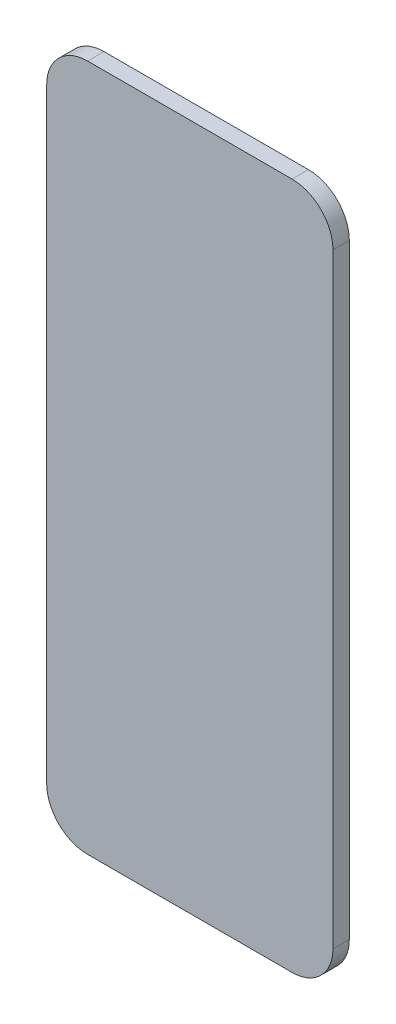
ISO-10303-21;
HEADER;
FILE_DESCRIPTION(('STEP AP214'),'2;1');
FILE_NAME('part.step','',(''),(''),'','','');
FILE_SCHEMA(('AUTOMOTIVE_DESIGN { 1 0 10303 214 1 1 1 1 }'));
ENDSEC;
DATA;
#1=APPLICATION_CONTEXT('core data for automotive mechanical design processes');
#2=APPLICATION_PROTOCOL_DEFINITION('international standard','automotive_design',2000,#1);
#3=PRODUCT_CONTEXT('',#1,'mechanical');
#4=PRODUCT('Part','Part','',(#3));
#5=PRODUCT_RELATED_PRODUCT_CATEGORY('part','',(#4));
#6=PRODUCT_DEFINITION_FORMATION('','',#4);
#7=PRODUCT_DEFINITION_CONTEXT('part definition',#1,'design');
#8=PRODUCT_DEFINITION('design','',#6,#7);
#9=PRODUCT_DEFINITION_SHAPE('','',#8);
#10=(LENGTH_UNIT() NAMED_UNIT(*) SI_UNIT(.MILLI.,.METRE.));
#11=(NAMED_UNIT(*) PLANE_ANGLE_UNIT() SI_UNIT($,.RADIAN.));
#12=(NAMED_UNIT(*) SI_UNIT($,.STERADIAN.) SOLID_ANGLE_UNIT());
#13=UNCERTAINTY_MEASURE_WITH_UNIT(LENGTH_MEASURE(1.E-05),#10,'distance_accuracy_value','');
#14=(GEOMETRIC_REPRESENTATION_CONTEXT(3) GLOBAL_UNCERTAINTY_ASSIGNED_CONTEXT((#13)) GLOBAL_UNIT_ASSIGNED_CONTEXT((#10,
#11,#12)) REPRESENTATION_CONTEXT('',''));
#15=CARTESIAN_POINT('',(0.,0.,0.));
#16=DIRECTION('',(0.,0.,1.));
#17=DIRECTION('',(1.,0.,0.));
#18=AXIS2_PLACEMENT_3D('',#15,#16,#17);
#19=CARTESIAN_POINT('',(0.,0.,40.));
#20=DIRECTION('',(1.,0.,0.));
#21=DIRECTION('',(0.,1.,0.));
#22=AXIS2_PLACEMENT_3D('',#19,#20,#21);
#23=PLANE('',#22);
#24=DIRECTION('',(0.,-1.,0.));
#25=VECTOR('',#24,1.);
#26=CARTESIAN_POINT('',(0.,0.,0.));
#27=LINE('',#26,#25);
#28=CARTESIAN_POINT('',(-3.13241496233526E-13,1580.,0.));
#29=VERTEX_POINT('',#28);
#30=CARTESIAN_POINT('',(0.,100.,0.));
#31=VERTEX_POINT('',#30);
#32=EDGE_CURVE('E131',#29,#31,#27,.T.);
#33=ORIENTED_EDGE('',*,*,#32,.T.);
#34=DIRECTION('',(0.,0.,-1.));
#35=VECTOR('',#34,1.);
#36=CARTESIAN_POINT('',(0.,100.,40.));
#37=LINE('',#36,#35);
#38=CARTESIAN_POINT('',(0.,100.,40.));
#39=VERTEX_POINT('',#38);
#40=EDGE_CURVE('E154',#31,#39,#37,.F.);
#41=ORIENTED_EDGE('',*,*,#40,.T.);
#42=DIRECTION('',(0.,-1.,0.));
#43=VECTOR('',#42,1.);
#44=CARTESIAN_POINT('',(0.,0.,40.));
#45=LINE('',#44,#43);
#46=CARTESIAN_POINT('',(-3.13241496233526E-13,1580.,40.));
#47=VERTEX_POINT('',#46);
#48=EDGE_CURVE('E129',#47,#39,#45,.T.);
#49=ORIENTED_EDGE('',*,*,#48,.F.);
#50=DIRECTION('',(0.,0.,-1.));
#51=VECTOR('',#50,1.);
#52=CARTESIAN_POINT('',(-3.13241496233526E-13,1580.,40.));
#53=LINE('',#52,#51);
#54=EDGE_CURVE('E151',#47,#29,#53,.T.);
#55=ORIENTED_EDGE('',*,*,#54,.T.);
#56=EDGE_LOOP('',(#33,#41,#49,#55));
#57=FACE_BOUND('',#56,.T.);
#58=ADVANCED_FACE('F36',(#57),#23,.F.);
#59=CARTESIAN_POINT('',(0.,0.,40.));
#60=DIRECTION('',(0.,1.,0.));
#61=DIRECTION('',(0.,0.,1.));
#62=AXIS2_PLACEMENT_3D('',#59,#60,#61);
#63=PLANE('',#62);
#64=DIRECTION('',(1.,0.,0.));
#65=VECTOR('',#64,1.);
#66=CARTESIAN_POINT('',(0.,0.,0.));
#67=LINE('',#66,#65);
#68=CARTESIAN_POINT('',(100.,0.,0.));
#69=VERTEX_POINT('',#68);
#70=CARTESIAN_POINT('',(600.,0.,0.));
#71=VERTEX_POINT('',#70);
#72=EDGE_CURVE('E127',#69,#71,#67,.T.);
#73=ORIENTED_EDGE('',*,*,#72,.T.);
#74=DIRECTION('',(0.,0.,-1.));
#75=VECTOR('',#74,1.);
#76=CARTESIAN_POINT('',(600.,0.,40.));
#77=LINE('',#76,#75);
#78=CARTESIAN_POINT('',(600.,0.,40.));
#79=VERTEX_POINT('',#78);
#80=EDGE_CURVE('E106',#71,#79,#77,.F.);
#81=ORIENTED_EDGE('',*,*,#80,.T.);
#82=DIRECTION('',(1.,0.,0.));
#83=VECTOR('',#82,1.);
#84=CARTESIAN_POINT('',(0.,0.,40.));
#85=LINE('',#84,#83);
#86=CARTESIAN_POINT('',(100.,0.,40.));
#87=VERTEX_POINT('',#86);
#88=EDGE_CURVE('E170',#87,#79,#85,.T.);
#89=ORIENTED_EDGE('',*,*,#88,.F.);
#90=DIRECTION('',(0.,0.,-1.));
#91=VECTOR('',#90,1.);
#92=CARTESIAN_POINT('',(100.,0.,40.));
#93=LINE('',#92,#91);
#94=EDGE_CURVE('E111',#87,#69,#93,.T.);
#95=ORIENTED_EDGE('',*,*,#94,.T.);
#96=EDGE_LOOP('',(#73,#81,#89,#95));
#97=FACE_BOUND('',#96,.T.);
#98=ADVANCED_FACE('F187',(#97),#63,.F.);
#99=CARTESIAN_POINT('',(700.,0.,40.));
#100=DIRECTION('',(-1.,0.,0.));
#101=DIRECTION('',(0.,-1.,0.));
#102=AXIS2_PLACEMENT_3D('',#99,#100,#101);
#103=PLANE('',#102);
#104=DIRECTION('',(0.,1.,0.));
#105=VECTOR('',#104,1.);
#106=CARTESIAN_POINT('',(700.,0.,40.));
#107=LINE('',#106,#105);
#108=CARTESIAN_POINT('',(700.,100.,40.));
#109=VERTEX_POINT('',#108);
#110=CARTESIAN_POINT('',(700.,1580.,40.));
#111=VERTEX_POINT('',#110);
#112=EDGE_CURVE('E120',#109,#111,#107,.T.);
#113=ORIENTED_EDGE('',*,*,#112,.F.);
#114=DIRECTION('',(0.,0.,-1.));
#115=VECTOR('',#114,1.);
#116=CARTESIAN_POINT('',(700.,100.,40.));
#117=LINE('',#116,#115);
#118=CARTESIAN_POINT('',(700.,100.,0.));
#119=VERTEX_POINT('',#118);
#120=EDGE_CURVE('E105',#109,#119,#117,.T.);
#121=ORIENTED_EDGE('',*,*,#120,.T.);
#122=DIRECTION('',(0.,1.,0.));
#123=VECTOR('',#122,1.);
#124=CARTESIAN_POINT('',(700.,0.,0.));
#125=LINE('',#124,#123);
#126=CARTESIAN_POINT('',(700.,1580.,0.));
#127=VERTEX_POINT('',#126);
#128=EDGE_CURVE('E118',#119,#127,#125,.T.);
#129=ORIENTED_EDGE('',*,*,#128,.T.);
#130=DIRECTION('',(0.,0.,-1.));
#131=VECTOR('',#130,1.);
#132=CARTESIAN_POINT('',(700.,1580.,40.));
#133=LINE('',#132,#131);
#134=EDGE_CURVE('E122',#127,#111,#133,.F.);
#135=ORIENTED_EDGE('',*,*,#134,.T.);
#136=EDGE_LOOP('',(#113,#121,#129,#135));
#137=FACE_BOUND('',#136,.T.);
#138=ADVANCED_FACE('F117',(#137),#103,.F.);
#139=CARTESIAN_POINT('',(-3.33066907387547E-13,1680.,40.));
#140=DIRECTION('',(0.,-1.,0.));
#141=DIRECTION('',(0.,0.,-1.));
#142=AXIS2_PLACEMENT_3D('',#139,#140,#141);
#143=PLANE('',#142);
#144=DIRECTION('',(-1.,0.,0.));
#145=VECTOR('',#144,1.);
#146=CARTESIAN_POINT('',(-3.33066907387547E-13,1680.,0.));
#147=LINE('',#146,#145);
#148=CARTESIAN_POINT('',(600.,1680.,0.));
#149=VERTEX_POINT('',#148);
#150=CARTESIAN_POINT('',(99.9999999999997,1680.,0.));
#151=VERTEX_POINT('',#150);
#152=EDGE_CURVE('E126',#149,#151,#147,.T.);
#153=ORIENTED_EDGE('',*,*,#152,.T.);
#154=DIRECTION('',(0.,0.,-1.));
#155=VECTOR('',#154,1.);
#156=CARTESIAN_POINT('',(99.9999999999997,1680.,40.));
#157=LINE('',#156,#155);
#158=CARTESIAN_POINT('',(99.9999999999997,1680.,40.));
#159=VERTEX_POINT('',#158);
#160=EDGE_CURVE('E11',#151,#159,#157,.F.);
#161=ORIENTED_EDGE('',*,*,#160,.T.);
#162=DIRECTION('',(-1.,0.,0.));
#163=VECTOR('',#162,1.);
#164=CARTESIAN_POINT('',(-3.33066907387547E-13,1680.,40.));
#165=LINE('',#164,#163);
#166=CARTESIAN_POINT('',(600.,1680.,40.));
#167=VERTEX_POINT('',#166);
#168=EDGE_CURVE('E135',#167,#159,#165,.T.);
#169=ORIENTED_EDGE('',*,*,#168,.F.);
#170=DIRECTION('',(0.,0.,-1.));
#171=VECTOR('',#170,1.);
#172=CARTESIAN_POINT('',(600.,1680.,40.));
#173=LINE('',#172,#171);
#174=EDGE_CURVE('E44',#167,#149,#173,.T.);
#175=ORIENTED_EDGE('',*,*,#174,.T.);
#176=EDGE_LOOP('',(#153,#161,#169,#175));
#177=FACE_BOUND('',#176,.T.);
#178=ADVANCED_FACE('F157',(#177),#143,.F.);
#179=CARTESIAN_POINT('',(0.,0.,40.));
#180=DIRECTION('',(0.,0.,-1.));
#181=DIRECTION('',(-1.,0.,0.));
#182=AXIS2_PLACEMENT_3D('',#179,#180,#181);
#183=PLANE('',#182);
#184=ORIENTED_EDGE('',*,*,#88,.T.);
#185=CARTESIAN_POINT('',(600.,100.,40.));
#186=DIRECTION('',(0.,0.,-1.));
#187=DIRECTION('',(-1.,0.,0.));
#188=AXIS2_PLACEMENT_3D('',#185,#186,#187);
#189=CIRCLE('',#188,100.);
#190=EDGE_CURVE('E149',#79,#109,#189,.F.);
#191=ORIENTED_EDGE('',*,*,#190,.T.);
#192=ORIENTED_EDGE('',*,*,#112,.T.);
#193=CARTESIAN_POINT('',(600.,1580.,40.));
#194=DIRECTION('',(0.,0.,-1.));
#195=DIRECTION('',(-1.,0.,0.));
#196=AXIS2_PLACEMENT_3D('',#193,#194,#195);
#197=CIRCLE('',#196,100.);
#198=EDGE_CURVE('E56',#111,#167,#197,.F.);
#199=ORIENTED_EDGE('',*,*,#198,.T.);
#200=ORIENTED_EDGE('',*,*,#168,.T.);
#201=CARTESIAN_POINT('',(99.9999999999997,1580.,40.));
#202=DIRECTION('',(0.,0.,-1.));
#203=DIRECTION('',(-1.,0.,0.));
#204=AXIS2_PLACEMENT_3D('',#201,#202,#203);
#205=CIRCLE('',#204,100.);
#206=EDGE_CURVE('E145',#159,#47,#205,.F.);
#207=ORIENTED_EDGE('',*,*,#206,.T.);
#208=ORIENTED_EDGE('',*,*,#48,.T.);
#209=CARTESIAN_POINT('',(100.,100.,40.));
#210=DIRECTION('',(0.,0.,-1.));
#211=DIRECTION('',(-1.,0.,0.));
#212=AXIS2_PLACEMENT_3D('',#209,#210,#211);
#213=CIRCLE('',#212,100.);
#214=EDGE_CURVE('E147',#39,#87,#213,.F.);
#215=ORIENTED_EDGE('',*,*,#214,.T.);
#216=EDGE_LOOP('',(#184,#191,#192,#199,#200,#207,#208,#215));
#217=FACE_BOUND('',#216,.T.);
#218=ADVANCED_FACE('F176',(#217),#183,.F.);
#219=CARTESIAN_POINT('',(0.,0.,0.));
#220=DIRECTION('',(0.,0.,-1.));
#221=DIRECTION('',(-1.,0.,0.));
#222=AXIS2_PLACEMENT_3D('',#219,#220,#221);
#223=PLANE('',#222);
#224=ORIENTED_EDGE('',*,*,#128,.F.);
#225=CARTESIAN_POINT('',(600.,100.,0.));
#226=DIRECTION('',(0.,0.,-1.));
#227=DIRECTION('',(-1.,0.,0.));
#228=AXIS2_PLACEMENT_3D('',#225,#226,#227);
#229=CIRCLE('',#228,100.);
#230=EDGE_CURVE('E101',#119,#71,#229,.T.);
#231=ORIENTED_EDGE('',*,*,#230,.T.);
#232=ORIENTED_EDGE('',*,*,#72,.F.);
#233=CARTESIAN_POINT('',(100.,100.,0.));
#234=DIRECTION('',(0.,0.,-1.));
#235=DIRECTION('',(-1.,0.,0.));
#236=AXIS2_PLACEMENT_3D('',#233,#234,#235);
#237=CIRCLE('',#236,100.);
#238=EDGE_CURVE('E112',#69,#31,#237,.T.);
#239=ORIENTED_EDGE('',*,*,#238,.T.);
#240=ORIENTED_EDGE('',*,*,#32,.F.);
#241=CARTESIAN_POINT('',(99.9999999999997,1580.,0.));
#242=DIRECTION('',(0.,0.,-1.));
#243=DIRECTION('',(-1.,0.,0.));
#244=AXIS2_PLACEMENT_3D('',#241,#242,#243);
#245=CIRCLE('',#244,100.);
#246=EDGE_CURVE('E138',#29,#151,#245,.T.);
#247=ORIENTED_EDGE('',*,*,#246,.T.);
#248=ORIENTED_EDGE('',*,*,#152,.F.);
#249=CARTESIAN_POINT('',(600.,1580.,0.));
#250=DIRECTION('',(0.,0.,-1.));
#251=DIRECTION('',(-1.,0.,0.));
#252=AXIS2_PLACEMENT_3D('',#249,#250,#251);
#253=CIRCLE('',#252,100.);
#254=EDGE_CURVE('E121',#149,#127,#253,.T.);
#255=ORIENTED_EDGE('',*,*,#254,.T.);
#256=EDGE_LOOP('',(#224,#231,#232,#239,#240,#247,#248,#255));
#257=FACE_BOUND('',#256,.T.);
#258=ADVANCED_FACE('F124',(#257),#223,.T.);
#259=CARTESIAN_POINT('',(600.,100.,40.));
#260=DIRECTION('',(0.,0.,-1.));
#261=DIRECTION('',(-1.,0.,0.));
#262=AXIS2_PLACEMENT_3D('',#259,#260,#261);
#263=CYLINDRICAL_SURFACE('',#262,100.);
#264=ORIENTED_EDGE('',*,*,#190,.F.);
#265=ORIENTED_EDGE('',*,*,#80,.F.);
#266=ORIENTED_EDGE('',*,*,#230,.F.);
#267=ORIENTED_EDGE('',*,*,#120,.F.);
#268=EDGE_LOOP('',(#264,#265,#266,#267));
#269=FACE_BOUND('',#268,.T.);
#270=ADVANCED_FACE('F104',(#269),#263,.T.);
#271=CARTESIAN_POINT('',(100.,100.,40.));
#272=DIRECTION('',(0.,0.,-1.));
#273=DIRECTION('',(-1.,0.,0.));
#274=AXIS2_PLACEMENT_3D('',#271,#272,#273);
#275=CYLINDRICAL_SURFACE('',#274,100.);
#276=ORIENTED_EDGE('',*,*,#214,.F.);
#277=ORIENTED_EDGE('',*,*,#40,.F.);
#278=ORIENTED_EDGE('',*,*,#238,.F.);
#279=ORIENTED_EDGE('',*,*,#94,.F.);
#280=EDGE_LOOP('',(#276,#277,#278,#279));
#281=FACE_BOUND('',#280,.T.);
#282=ADVANCED_FACE('F198',(#281),#275,.T.);
#283=CARTESIAN_POINT('',(99.9999999999997,1580.,40.));
#284=DIRECTION('',(0.,0.,-1.));
#285=DIRECTION('',(-1.,0.,0.));
#286=AXIS2_PLACEMENT_3D('',#283,#284,#285);
#287=CYLINDRICAL_SURFACE('',#286,100.);
#288=ORIENTED_EDGE('',*,*,#206,.F.);
#289=ORIENTED_EDGE('',*,*,#160,.F.);
#290=ORIENTED_EDGE('',*,*,#246,.F.);
#291=ORIENTED_EDGE('',*,*,#54,.F.);
#292=EDGE_LOOP('',(#288,#289,#290,#291));
#293=FACE_BOUND('',#292,.T.);
#294=ADVANCED_FACE('F164',(#293),#287,.T.);
#295=CARTESIAN_POINT('',(600.,1580.,40.));
#296=DIRECTION('',(0.,0.,-1.));
#297=DIRECTION('',(-1.,0.,0.));
#298=AXIS2_PLACEMENT_3D('',#295,#296,#297);
#299=CYLINDRICAL_SURFACE('',#298,100.);
#300=ORIENTED_EDGE('',*,*,#198,.F.);
#301=ORIENTED_EDGE('',*,*,#134,.F.);
#302=ORIENTED_EDGE('',*,*,#254,.F.);
#303=ORIENTED_EDGE('',*,*,#174,.F.);
#304=EDGE_LOOP('',(#300,#301,#302,#303));
#305=FACE_BOUND('',#304,.T.);
#306=ADVANCED_FACE('F38',(#305),#299,.T.);
#307=CLOSED_SHELL('',(#58,#98,#138,#178,#218,#258,#270,#282,#294,#306));
#308=MANIFOLD_SOLID_BREP('B2',#307);
#309=ADVANCED_BREP_SHAPE_REPRESENTATION('',(#18,#308),#14);
#310=SHAPE_DEFINITION_REPRESENTATION(#9,#309);
ENDSEC;
END-ISO-10303-21;
